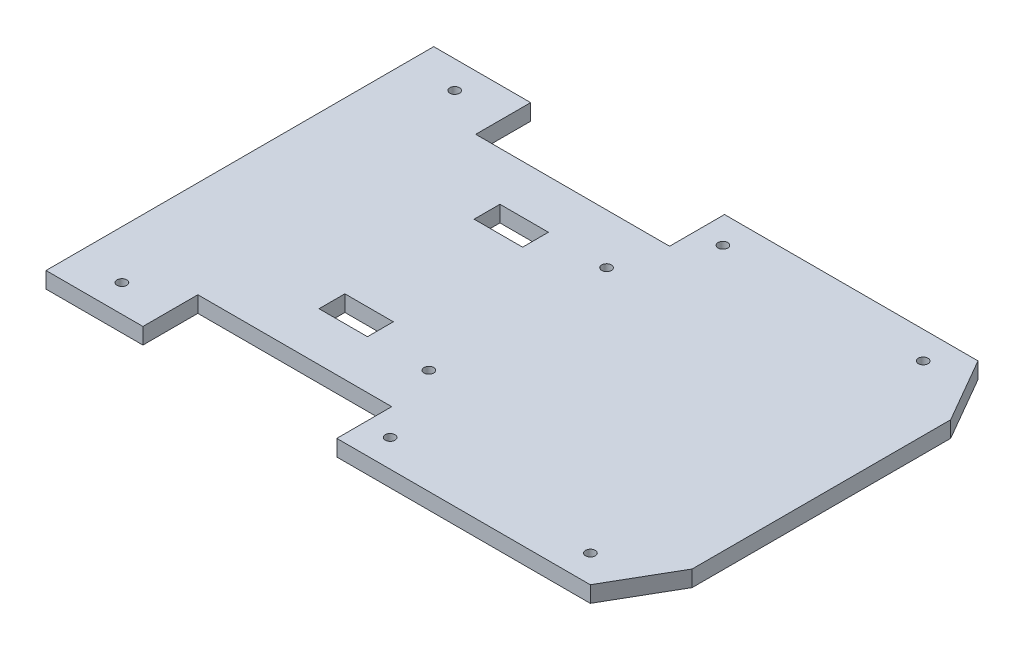
ISO-10303-21;
HEADER;
FILE_DESCRIPTION(('STEP AP214'),'2;1');
FILE_NAME('part.step','',(''),(''),'','','');
FILE_SCHEMA(('AUTOMOTIVE_DESIGN { 1 0 10303 214 1 1 1 1 }'));
ENDSEC;
DATA;
#1=APPLICATION_CONTEXT('core data for automotive mechanical design processes');
#2=APPLICATION_PROTOCOL_DEFINITION('international standard','automotive_design',2000,#1);
#3=PRODUCT_CONTEXT('',#1,'mechanical');
#4=PRODUCT('Part','Part','',(#3));
#5=PRODUCT_RELATED_PRODUCT_CATEGORY('part','',(#4));
#6=PRODUCT_DEFINITION_FORMATION('','',#4);
#7=PRODUCT_DEFINITION_CONTEXT('part definition',#1,'design');
#8=PRODUCT_DEFINITION('design','',#6,#7);
#9=PRODUCT_DEFINITION_SHAPE('','',#8);
#10=(LENGTH_UNIT() NAMED_UNIT(*) SI_UNIT(.MILLI.,.METRE.));
#11=(NAMED_UNIT(*) PLANE_ANGLE_UNIT() SI_UNIT($,.RADIAN.));
#12=(NAMED_UNIT(*) SI_UNIT($,.STERADIAN.) SOLID_ANGLE_UNIT());
#13=UNCERTAINTY_MEASURE_WITH_UNIT(LENGTH_MEASURE(1.E-05),#10,'distance_accuracy_value','');
#14=(GEOMETRIC_REPRESENTATION_CONTEXT(3) GLOBAL_UNCERTAINTY_ASSIGNED_CONTEXT((#13)) GLOBAL_UNIT_ASSIGNED_CONTEXT((#10,
#11,#12)) REPRESENTATION_CONTEXT('',''));
#15=CARTESIAN_POINT('',(0.,0.,0.));
#16=DIRECTION('',(0.,0.,1.));
#17=DIRECTION('',(1.,0.,0.));
#18=AXIS2_PLACEMENT_3D('',#15,#16,#17);
#19=CARTESIAN_POINT('',(0.,5.,0.));
#20=DIRECTION('',(0.,-1.,0.));
#21=DIRECTION('',(0.,0.,-1.));
#22=AXIS2_PLACEMENT_3D('',#19,#20,#21);
#23=PLANE('',#22);
#24=DIRECTION('',(0.,0.,1.));
#25=VECTOR('',#24,1.);
#26=CARTESIAN_POINT('',(-90.,5.,0.));
#27=LINE('',#26,#25);
#28=CARTESIAN_POINT('',(-90.,5.,-60.));
#29=VERTEX_POINT('',#28);
#30=CARTESIAN_POINT('',(-90.,5.,60.));
#31=VERTEX_POINT('',#30);
#32=EDGE_CURVE('E386',#29,#31,#27,.T.);
#33=ORIENTED_EDGE('',*,*,#32,.T.);
#34=DIRECTION('',(-1.,0.,0.));
#35=VECTOR('',#34,1.);
#36=CARTESIAN_POINT('',(-90.,5.,60.));
#37=LINE('',#36,#35);
#38=CARTESIAN_POINT('',(-60.,5.,60.));
#39=VERTEX_POINT('',#38);
#40=EDGE_CURVE('E246',#39,#31,#37,.T.);
#41=ORIENTED_EDGE('',*,*,#40,.F.);
#42=DIRECTION('',(0.,0.,1.));
#43=VECTOR('',#42,1.);
#44=CARTESIAN_POINT('',(-60.,5.,60.));
#45=LINE('',#44,#43);
#46=CARTESIAN_POINT('',(-60.,5.,43.));
#47=VERTEX_POINT('',#46);
#48=EDGE_CURVE('E250',#47,#39,#45,.T.);
#49=ORIENTED_EDGE('',*,*,#48,.F.);
#50=DIRECTION('',(-1.,0.,0.));
#51=VECTOR('',#50,1.);
#52=CARTESIAN_POINT('',(-60.,5.,43.));
#53=LINE('',#52,#51);
#54=CARTESIAN_POINT('',(0.,5.,43.));
#55=VERTEX_POINT('',#54);
#56=EDGE_CURVE('E255',#55,#47,#53,.T.);
#57=ORIENTED_EDGE('',*,*,#56,.F.);
#58=DIRECTION('',(0.,0.,-1.));
#59=VECTOR('',#58,1.);
#60=CARTESIAN_POINT('',(0.,5.,43.));
#61=LINE('',#60,#59);
#62=CARTESIAN_POINT('',(0.,5.,60.));
#63=VERTEX_POINT('',#62);
#64=EDGE_CURVE('E259',#63,#55,#61,.T.);
#65=ORIENTED_EDGE('',*,*,#64,.F.);
#66=DIRECTION('',(-1.,0.,0.));
#67=VECTOR('',#66,1.);
#68=CARTESIAN_POINT('',(0.,5.,60.));
#69=LINE('',#68,#67);
#70=CARTESIAN_POINT('',(78.4529946162075,5.,60.));
#71=VERTEX_POINT('',#70);
#72=EDGE_CURVE('E263',#71,#63,#69,.T.);
#73=ORIENTED_EDGE('',*,*,#72,.F.);
#74=DIRECTION('',(-0.499999999999998,0.,0.86602540378444));
#75=VECTOR('',#74,1.);
#76=CARTESIAN_POINT('',(78.4529946162075,5.,60.));
#77=LINE('',#76,#75);
#78=CARTESIAN_POINT('',(90.,5.,40.));
#79=VERTEX_POINT('',#78);
#80=EDGE_CURVE('E267',#79,#71,#77,.T.);
#81=ORIENTED_EDGE('',*,*,#80,.F.);
#82=DIRECTION('',(0.,0.,-1.));
#83=VECTOR('',#82,1.);
#84=CARTESIAN_POINT('',(90.,5.,0.));
#85=LINE('',#84,#83);
#86=CARTESIAN_POINT('',(90.,5.,-40.));
#87=VERTEX_POINT('',#86);
#88=EDGE_CURVE('E389',#79,#87,#85,.T.);
#89=ORIENTED_EDGE('',*,*,#88,.T.);
#90=DIRECTION('',(-0.499999999999998,0.,-0.86602540378444));
#91=VECTOR('',#90,1.);
#92=CARTESIAN_POINT('',(78.4529946162075,5.,-60.));
#93=LINE('',#92,#91);
#94=CARTESIAN_POINT('',(78.4529946162075,5.,-60.));
#95=VERTEX_POINT('',#94);
#96=EDGE_CURVE('E393',#87,#95,#93,.T.);
#97=ORIENTED_EDGE('',*,*,#96,.T.);
#98=DIRECTION('',(-1.,0.,0.));
#99=VECTOR('',#98,1.);
#100=CARTESIAN_POINT('',(0.,5.,-60.));
#101=LINE('',#100,#99);
#102=CARTESIAN_POINT('',(0.,5.,-60.));
#103=VERTEX_POINT('',#102);
#104=EDGE_CURVE('E396',#95,#103,#101,.T.);
#105=ORIENTED_EDGE('',*,*,#104,.T.);
#106=DIRECTION('',(0.,0.,1.));
#107=VECTOR('',#106,1.);
#108=CARTESIAN_POINT('',(0.,5.,-43.));
#109=LINE('',#108,#107);
#110=CARTESIAN_POINT('',(0.,5.,-43.));
#111=VERTEX_POINT('',#110);
#112=EDGE_CURVE('E399',#103,#111,#109,.T.);
#113=ORIENTED_EDGE('',*,*,#112,.T.);
#114=DIRECTION('',(-1.,0.,0.));
#115=VECTOR('',#114,1.);
#116=CARTESIAN_POINT('',(-60.,5.,-43.));
#117=LINE('',#116,#115);
#118=CARTESIAN_POINT('',(-60.,5.,-43.));
#119=VERTEX_POINT('',#118);
#120=EDGE_CURVE('E402',#111,#119,#117,.T.);
#121=ORIENTED_EDGE('',*,*,#120,.T.);
#122=DIRECTION('',(0.,0.,-1.));
#123=VECTOR('',#122,1.);
#124=CARTESIAN_POINT('',(-60.,5.,-60.));
#125=LINE('',#124,#123);
#126=CARTESIAN_POINT('',(-60.,5.,-60.));
#127=VERTEX_POINT('',#126);
#128=EDGE_CURVE('E405',#119,#127,#125,.T.);
#129=ORIENTED_EDGE('',*,*,#128,.T.);
#130=DIRECTION('',(-1.,0.,0.));
#131=VECTOR('',#130,1.);
#132=CARTESIAN_POINT('',(-90.,5.,-60.));
#133=LINE('',#132,#131);
#134=EDGE_CURVE('E408',#127,#29,#133,.T.);
#135=ORIENTED_EDGE('',*,*,#134,.T.);
#136=EDGE_LOOP('',(#33,#41,#49,#57,#65,#73,#81,#89,#97,#105,#113,#121,#129,#135));
#137=FACE_BOUND('',#136,.T.);
#138=DIRECTION('',(0.,0.,1.));
#139=VECTOR('',#138,1.);
#140=CARTESIAN_POINT('',(-37.5,5.,-28.));
#141=LINE('',#140,#139);
#142=CARTESIAN_POINT('',(-37.5,5.,-28.));
#143=VERTEX_POINT('',#142);
#144=CARTESIAN_POINT('',(-37.5,5.,-20.));
#145=VERTEX_POINT('',#144);
#146=EDGE_CURVE('E348',#143,#145,#141,.T.);
#147=ORIENTED_EDGE('',*,*,#146,.F.);
#148=DIRECTION('',(-1.,0.,0.));
#149=VECTOR('',#148,1.);
#150=CARTESIAN_POINT('',(-37.5,5.,-28.));
#151=LINE('',#150,#149);
#152=CARTESIAN_POINT('',(-22.5,5.,-28.));
#153=VERTEX_POINT('',#152);
#154=EDGE_CURVE('E358',#153,#143,#151,.T.);
#155=ORIENTED_EDGE('',*,*,#154,.F.);
#156=DIRECTION('',(0.,0.,-1.));
#157=VECTOR('',#156,1.);
#158=CARTESIAN_POINT('',(-22.5,5.,-28.));
#159=LINE('',#158,#157);
#160=CARTESIAN_POINT('',(-22.5,5.,-20.));
#161=VERTEX_POINT('',#160);
#162=EDGE_CURVE('E355',#161,#153,#159,.T.);
#163=ORIENTED_EDGE('',*,*,#162,.F.);
#164=DIRECTION('',(1.,0.,0.));
#165=VECTOR('',#164,1.);
#166=CARTESIAN_POINT('',(-37.5,5.,-20.));
#167=LINE('',#166,#165);
#168=EDGE_CURVE('E351',#145,#161,#167,.T.);
#169=ORIENTED_EDGE('',*,*,#168,.F.);
#170=EDGE_LOOP('',(#147,#155,#163,#169));
#171=FACE_BOUND('',#170,.T.);
#172=CARTESIAN_POINT('',(-75.,5.,-51.5));
#173=DIRECTION('',(0.,1.,0.));
#174=DIRECTION('',(0.,0.,1.));
#175=AXIS2_PLACEMENT_3D('',#172,#173,#174);
#176=CIRCLE('',#175,1.5);
#177=CARTESIAN_POINT('',(-75.,5.,-50.));
#178=VERTEX_POINT('',#177);
#179=EDGE_CURVE('E341',#178,#178,#176,.T.);
#180=ORIENTED_EDGE('',*,*,#179,.F.);
#181=EDGE_LOOP('',(#180));
#182=FACE_BOUND('',#181,.T.);
#183=CARTESIAN_POINT('',(7.99999999999998,5.,-51.5));
#184=DIRECTION('',(0.,1.,0.));
#185=DIRECTION('',(0.,0.,1.));
#186=AXIS2_PLACEMENT_3D('',#183,#184,#185);
#187=CIRCLE('',#186,1.5);
#188=CARTESIAN_POINT('',(7.99999999999998,5.,-50.));
#189=VERTEX_POINT('',#188);
#190=EDGE_CURVE('E333',#189,#189,#187,.T.);
#191=ORIENTED_EDGE('',*,*,#190,.F.);
#192=EDGE_LOOP('',(#191));
#193=FACE_BOUND('',#192,.T.);
#194=CARTESIAN_POINT('',(70.,5.,-51.5));
#195=DIRECTION('',(0.,1.,0.));
#196=DIRECTION('',(0.,0.,1.));
#197=AXIS2_PLACEMENT_3D('',#194,#195,#196);
#198=CIRCLE('',#197,1.5);
#199=CARTESIAN_POINT('',(70.,5.,-50.));
#200=VERTEX_POINT('',#199);
#201=EDGE_CURVE('E325',#200,#200,#198,.T.);
#202=ORIENTED_EDGE('',*,*,#201,.F.);
#203=EDGE_LOOP('',(#202));
#204=FACE_BOUND('',#203,.T.);
#205=CARTESIAN_POINT('',(-4.00000000000002,5.,-27.5));
#206=DIRECTION('',(0.,1.,0.));
#207=DIRECTION('',(0.,0.,1.));
#208=AXIS2_PLACEMENT_3D('',#205,#206,#207);
#209=CIRCLE('',#208,1.5);
#210=CARTESIAN_POINT('',(-4.00000000000002,5.,-26.));
#211=VERTEX_POINT('',#210);
#212=EDGE_CURVE('E317',#211,#211,#209,.T.);
#213=ORIENTED_EDGE('',*,*,#212,.F.);
#214=EDGE_LOOP('',(#213));
#215=FACE_BOUND('',#214,.T.);
#216=CARTESIAN_POINT('',(-4.00000000000002,5.,27.5));
#217=DIRECTION('',(0.,-1.,0.));
#218=DIRECTION('',(0.,0.,-1.));
#219=AXIS2_PLACEMENT_3D('',#216,#217,#218);
#220=CIRCLE('',#219,1.5);
#221=CARTESIAN_POINT('',(-4.00000000000002,5.,26.));
#222=VERTEX_POINT('',#221);
#223=EDGE_CURVE('E611',#222,#222,#220,.T.);
#224=ORIENTED_EDGE('',*,*,#223,.T.);
#225=EDGE_LOOP('',(#224));
#226=FACE_BOUND('',#225,.T.);
#227=CARTESIAN_POINT('',(70.,5.,51.5));
#228=DIRECTION('',(0.,-1.,0.));
#229=DIRECTION('',(0.,0.,-1.));
#230=AXIS2_PLACEMENT_3D('',#227,#228,#229);
#231=CIRCLE('',#230,1.5);
#232=CARTESIAN_POINT('',(70.,5.,50.));
#233=VERTEX_POINT('',#232);
#234=EDGE_CURVE('E622',#233,#233,#231,.T.);
#235=ORIENTED_EDGE('',*,*,#234,.T.);
#236=EDGE_LOOP('',(#235));
#237=FACE_BOUND('',#236,.T.);
#238=CARTESIAN_POINT('',(7.99999999999998,5.,51.5));
#239=DIRECTION('',(0.,-1.,0.));
#240=DIRECTION('',(0.,0.,-1.));
#241=AXIS2_PLACEMENT_3D('',#238,#239,#240);
#242=CIRCLE('',#241,1.5);
#243=CARTESIAN_POINT('',(7.99999999999998,5.,50.));
#244=VERTEX_POINT('',#243);
#245=EDGE_CURVE('E630',#244,#244,#242,.T.);
#246=ORIENTED_EDGE('',*,*,#245,.T.);
#247=EDGE_LOOP('',(#246));
#248=FACE_BOUND('',#247,.T.);
#249=CARTESIAN_POINT('',(-75.,5.,51.5));
#250=DIRECTION('',(0.,-1.,0.));
#251=DIRECTION('',(0.,0.,-1.));
#252=AXIS2_PLACEMENT_3D('',#249,#250,#251);
#253=CIRCLE('',#252,1.5);
#254=CARTESIAN_POINT('',(-75.,5.,50.));
#255=VERTEX_POINT('',#254);
#256=EDGE_CURVE('E229',#255,#255,#253,.T.);
#257=ORIENTED_EDGE('',*,*,#256,.T.);
#258=EDGE_LOOP('',(#257));
#259=FACE_BOUND('',#258,.T.);
#260=DIRECTION('',(-1.,0.,0.));
#261=VECTOR('',#260,1.);
#262=CARTESIAN_POINT('',(-37.5,5.,28.));
#263=LINE('',#262,#261);
#264=CARTESIAN_POINT('',(-22.5,5.,28.));
#265=VERTEX_POINT('',#264);
#266=CARTESIAN_POINT('',(-37.5,5.,28.));
#267=VERTEX_POINT('',#266);
#268=EDGE_CURVE('E195',#265,#267,#263,.T.);
#269=ORIENTED_EDGE('',*,*,#268,.T.);
#270=DIRECTION('',(0.,0.,-1.));
#271=VECTOR('',#270,1.);
#272=CARTESIAN_POINT('',(-37.5,5.,28.));
#273=LINE('',#272,#271);
#274=CARTESIAN_POINT('',(-37.5,5.,20.));
#275=VERTEX_POINT('',#274);
#276=EDGE_CURVE('E206',#267,#275,#273,.T.);
#277=ORIENTED_EDGE('',*,*,#276,.T.);
#278=DIRECTION('',(1.,0.,0.));
#279=VECTOR('',#278,1.);
#280=CARTESIAN_POINT('',(-37.5,5.,20.));
#281=LINE('',#280,#279);
#282=CARTESIAN_POINT('',(-22.5,5.,20.));
#283=VERTEX_POINT('',#282);
#284=EDGE_CURVE('E220',#275,#283,#281,.T.);
#285=ORIENTED_EDGE('',*,*,#284,.T.);
#286=DIRECTION('',(0.,0.,1.));
#287=VECTOR('',#286,1.);
#288=CARTESIAN_POINT('',(-22.5,5.,28.));
#289=LINE('',#288,#287);
#290=EDGE_CURVE('E216',#283,#265,#289,.T.);
#291=ORIENTED_EDGE('',*,*,#290,.T.);
#292=EDGE_LOOP('',(#269,#277,#285,#291));
#293=FACE_BOUND('',#292,.T.);
#294=ADVANCED_FACE('F39',(#137,#171,#182,#193,#204,#215,#226,#237,#248,#259,#293),#23,.F.);
#295=CARTESIAN_POINT('',(0.,0.,0.));
#296=DIRECTION('',(0.,-1.,0.));
#297=DIRECTION('',(0.,0.,-1.));
#298=AXIS2_PLACEMENT_3D('',#295,#296,#297);
#299=PLANE('',#298);
#300=CARTESIAN_POINT('',(70.,0.,-51.5));
#301=DIRECTION('',(0.,1.,0.));
#302=DIRECTION('',(0.,0.,1.));
#303=AXIS2_PLACEMENT_3D('',#300,#301,#302);
#304=CIRCLE('',#303,1.5);
#305=CARTESIAN_POINT('',(70.,0.,-50.));
#306=VERTEX_POINT('',#305);
#307=EDGE_CURVE('E321',#306,#306,#304,.T.);
#308=ORIENTED_EDGE('',*,*,#307,.T.);
#309=EDGE_LOOP('',(#308));
#310=FACE_BOUND('',#309,.T.);
#311=CARTESIAN_POINT('',(-75.,0.,-51.5));
#312=DIRECTION('',(0.,1.,0.));
#313=DIRECTION('',(0.,0.,1.));
#314=AXIS2_PLACEMENT_3D('',#311,#312,#313);
#315=CIRCLE('',#314,1.5);
#316=CARTESIAN_POINT('',(-75.,0.,-50.));
#317=VERTEX_POINT('',#316);
#318=EDGE_CURVE('E337',#317,#317,#315,.T.);
#319=ORIENTED_EDGE('',*,*,#318,.T.);
#320=EDGE_LOOP('',(#319));
#321=FACE_BOUND('',#320,.T.);
#322=DIRECTION('',(0.,0.,1.));
#323=VECTOR('',#322,1.);
#324=CARTESIAN_POINT('',(-90.,0.,0.));
#325=LINE('',#324,#323);
#326=CARTESIAN_POINT('',(-90.,0.,-60.));
#327=VERTEX_POINT('',#326);
#328=CARTESIAN_POINT('',(-90.,0.,60.));
#329=VERTEX_POINT('',#328);
#330=EDGE_CURVE('E385',#327,#329,#325,.T.);
#331=ORIENTED_EDGE('',*,*,#330,.F.);
#332=DIRECTION('',(-1.,0.,0.));
#333=VECTOR('',#332,1.);
#334=CARTESIAN_POINT('',(-90.,0.,-60.));
#335=LINE('',#334,#333);
#336=CARTESIAN_POINT('',(-60.,0.,-60.));
#337=VERTEX_POINT('',#336);
#338=EDGE_CURVE('E390',#337,#327,#335,.T.);
#339=ORIENTED_EDGE('',*,*,#338,.F.);
#340=DIRECTION('',(0.,0.,-1.));
#341=VECTOR('',#340,1.);
#342=CARTESIAN_POINT('',(-60.,0.,-60.));
#343=LINE('',#342,#341);
#344=CARTESIAN_POINT('',(-60.,0.,-43.));
#345=VERTEX_POINT('',#344);
#346=EDGE_CURVE('E429',#345,#337,#343,.T.);
#347=ORIENTED_EDGE('',*,*,#346,.F.);
#348=DIRECTION('',(-1.,0.,0.));
#349=VECTOR('',#348,1.);
#350=CARTESIAN_POINT('',(-60.,0.,-43.));
#351=LINE('',#350,#349);
#352=CARTESIAN_POINT('',(0.,0.,-43.));
#353=VERTEX_POINT('',#352);
#354=EDGE_CURVE('E426',#353,#345,#351,.T.);
#355=ORIENTED_EDGE('',*,*,#354,.F.);
#356=DIRECTION('',(0.,0.,1.));
#357=VECTOR('',#356,1.);
#358=CARTESIAN_POINT('',(0.,0.,-43.));
#359=LINE('',#358,#357);
#360=CARTESIAN_POINT('',(0.,0.,-60.));
#361=VERTEX_POINT('',#360);
#362=EDGE_CURVE('E423',#361,#353,#359,.T.);
#363=ORIENTED_EDGE('',*,*,#362,.F.);
#364=DIRECTION('',(-1.,0.,0.));
#365=VECTOR('',#364,1.);
#366=CARTESIAN_POINT('',(0.,0.,-60.));
#367=LINE('',#366,#365);
#368=CARTESIAN_POINT('',(78.4529946162075,0.,-60.));
#369=VERTEX_POINT('',#368);
#370=EDGE_CURVE('E420',#369,#361,#367,.T.);
#371=ORIENTED_EDGE('',*,*,#370,.F.);
#372=DIRECTION('',(-0.499999999999998,0.,-0.86602540378444));
#373=VECTOR('',#372,1.);
#374=CARTESIAN_POINT('',(78.4529946162075,0.,-60.));
#375=LINE('',#374,#373);
#376=CARTESIAN_POINT('',(90.,0.,-40.));
#377=VERTEX_POINT('',#376);
#378=EDGE_CURVE('E417',#377,#369,#375,.T.);
#379=ORIENTED_EDGE('',*,*,#378,.F.);
#380=DIRECTION('',(0.,0.,-1.));
#381=VECTOR('',#380,1.);
#382=CARTESIAN_POINT('',(90.,0.,0.));
#383=LINE('',#382,#381);
#384=CARTESIAN_POINT('',(90.,0.,40.));
#385=VERTEX_POINT('',#384);
#386=EDGE_CURVE('E414',#385,#377,#383,.T.);
#387=ORIENTED_EDGE('',*,*,#386,.F.);
#388=DIRECTION('',(-0.499999999999998,0.,0.86602540378444));
#389=VECTOR('',#388,1.);
#390=CARTESIAN_POINT('',(78.4529946162075,0.,60.));
#391=LINE('',#390,#389);
#392=CARTESIAN_POINT('',(78.4529946162075,0.,60.));
#393=VERTEX_POINT('',#392);
#394=EDGE_CURVE('E251',#385,#393,#391,.T.);
#395=ORIENTED_EDGE('',*,*,#394,.T.);
#396=DIRECTION('',(-1.,0.,0.));
#397=VECTOR('',#396,1.);
#398=CARTESIAN_POINT('',(0.,0.,60.));
#399=LINE('',#398,#397);
#400=CARTESIAN_POINT('',(0.,0.,60.));
#401=VERTEX_POINT('',#400);
#402=EDGE_CURVE('E287',#393,#401,#399,.T.);
#403=ORIENTED_EDGE('',*,*,#402,.T.);
#404=DIRECTION('',(0.,0.,-1.));
#405=VECTOR('',#404,1.);
#406=CARTESIAN_POINT('',(0.,0.,43.));
#407=LINE('',#406,#405);
#408=CARTESIAN_POINT('',(0.,0.,43.));
#409=VERTEX_POINT('',#408);
#410=EDGE_CURVE('E283',#401,#409,#407,.T.);
#411=ORIENTED_EDGE('',*,*,#410,.T.);
#412=DIRECTION('',(-1.,0.,0.));
#413=VECTOR('',#412,1.);
#414=CARTESIAN_POINT('',(-60.,0.,43.));
#415=LINE('',#414,#413);
#416=CARTESIAN_POINT('',(-60.,0.,43.));
#417=VERTEX_POINT('',#416);
#418=EDGE_CURVE('E279',#409,#417,#415,.T.);
#419=ORIENTED_EDGE('',*,*,#418,.T.);
#420=DIRECTION('',(0.,0.,1.));
#421=VECTOR('',#420,1.);
#422=CARTESIAN_POINT('',(-60.,0.,60.));
#423=LINE('',#422,#421);
#424=CARTESIAN_POINT('',(-60.,0.,60.));
#425=VERTEX_POINT('',#424);
#426=EDGE_CURVE('E275',#417,#425,#423,.T.);
#427=ORIENTED_EDGE('',*,*,#426,.T.);
#428=DIRECTION('',(-1.,0.,0.));
#429=VECTOR('',#428,1.);
#430=CARTESIAN_POINT('',(-90.,0.,60.));
#431=LINE('',#430,#429);
#432=EDGE_CURVE('E202',#425,#329,#431,.T.);
#433=ORIENTED_EDGE('',*,*,#432,.T.);
#434=EDGE_LOOP('',(#331,#339,#347,#355,#363,#371,#379,#387,#395,#403,#411,#419,#427,#433));
#435=FACE_BOUND('',#434,.T.);
#436=DIRECTION('',(-1.,0.,0.));
#437=VECTOR('',#436,1.);
#438=CARTESIAN_POINT('',(-37.5,0.,-28.));
#439=LINE('',#438,#437);
#440=CARTESIAN_POINT('',(-22.5,0.,-28.));
#441=VERTEX_POINT('',#440);
#442=CARTESIAN_POINT('',(-37.5,0.,-28.));
#443=VERTEX_POINT('',#442);
#444=EDGE_CURVE('E352',#441,#443,#439,.T.);
#445=ORIENTED_EDGE('',*,*,#444,.T.);
#446=DIRECTION('',(0.,0.,1.));
#447=VECTOR('',#446,1.);
#448=CARTESIAN_POINT('',(-37.5,0.,-28.));
#449=LINE('',#448,#447);
#450=CARTESIAN_POINT('',(-37.5,0.,-20.));
#451=VERTEX_POINT('',#450);
#452=EDGE_CURVE('E63',#443,#451,#449,.T.);
#453=ORIENTED_EDGE('',*,*,#452,.T.);
#454=DIRECTION('',(1.,0.,0.));
#455=VECTOR('',#454,1.);
#456=CARTESIAN_POINT('',(-37.5,0.,-20.));
#457=LINE('',#456,#455);
#458=CARTESIAN_POINT('',(-22.5,0.,-20.));
#459=VERTEX_POINT('',#458);
#460=EDGE_CURVE('E364',#451,#459,#457,.T.);
#461=ORIENTED_EDGE('',*,*,#460,.T.);
#462=DIRECTION('',(0.,0.,-1.));
#463=VECTOR('',#462,1.);
#464=CARTESIAN_POINT('',(-22.5,0.,-28.));
#465=LINE('',#464,#463);
#466=EDGE_CURVE('E368',#459,#441,#465,.T.);
#467=ORIENTED_EDGE('',*,*,#466,.T.);
#468=EDGE_LOOP('',(#445,#453,#461,#467));
#469=FACE_BOUND('',#468,.T.);
#470=CARTESIAN_POINT('',(7.99999999999998,0.,-51.5));
#471=DIRECTION('',(0.,1.,0.));
#472=DIRECTION('',(0.,0.,1.));
#473=AXIS2_PLACEMENT_3D('',#470,#471,#472);
#474=CIRCLE('',#473,1.5);
#475=CARTESIAN_POINT('',(7.99999999999998,0.,-50.));
#476=VERTEX_POINT('',#475);
#477=EDGE_CURVE('E329',#476,#476,#474,.T.);
#478=ORIENTED_EDGE('',*,*,#477,.T.);
#479=EDGE_LOOP('',(#478));
#480=FACE_BOUND('',#479,.T.);
#481=CARTESIAN_POINT('',(-4.00000000000002,0.,-27.5));
#482=DIRECTION('',(0.,1.,0.));
#483=DIRECTION('',(0.,0.,1.));
#484=AXIS2_PLACEMENT_3D('',#481,#482,#483);
#485=CIRCLE('',#484,1.5);
#486=CARTESIAN_POINT('',(-4.00000000000002,0.,-26.));
#487=VERTEX_POINT('',#486);
#488=EDGE_CURVE('E316',#487,#487,#485,.T.);
#489=ORIENTED_EDGE('',*,*,#488,.T.);
#490=EDGE_LOOP('',(#489));
#491=FACE_BOUND('',#490,.T.);
#492=CARTESIAN_POINT('',(-4.00000000000002,0.,27.5));
#493=DIRECTION('',(0.,-1.,0.));
#494=DIRECTION('',(0.,0.,-1.));
#495=AXIS2_PLACEMENT_3D('',#492,#493,#494);
#496=CIRCLE('',#495,1.5);
#497=CARTESIAN_POINT('',(-4.00000000000002,0.,26.));
#498=VERTEX_POINT('',#497);
#499=EDGE_CURVE('E614',#498,#498,#496,.T.);
#500=ORIENTED_EDGE('',*,*,#499,.F.);
#501=EDGE_LOOP('',(#500));
#502=FACE_BOUND('',#501,.T.);
#503=CARTESIAN_POINT('',(70.,0.,51.5));
#504=DIRECTION('',(0.,-1.,0.));
#505=DIRECTION('',(0.,0.,-1.));
#506=AXIS2_PLACEMENT_3D('',#503,#504,#505);
#507=CIRCLE('',#506,1.5);
#508=CARTESIAN_POINT('',(70.,0.,50.));
#509=VERTEX_POINT('',#508);
#510=EDGE_CURVE('E619',#509,#509,#507,.T.);
#511=ORIENTED_EDGE('',*,*,#510,.F.);
#512=EDGE_LOOP('',(#511));
#513=FACE_BOUND('',#512,.T.);
#514=CARTESIAN_POINT('',(7.99999999999998,0.,51.5));
#515=DIRECTION('',(0.,-1.,0.));
#516=DIRECTION('',(0.,0.,-1.));
#517=AXIS2_PLACEMENT_3D('',#514,#515,#516);
#518=CIRCLE('',#517,1.5);
#519=CARTESIAN_POINT('',(7.99999999999998,0.,50.));
#520=VERTEX_POINT('',#519);
#521=EDGE_CURVE('E626',#520,#520,#518,.T.);
#522=ORIENTED_EDGE('',*,*,#521,.F.);
#523=EDGE_LOOP('',(#522));
#524=FACE_BOUND('',#523,.T.);
#525=CARTESIAN_POINT('',(-75.,0.,51.5));
#526=DIRECTION('',(0.,-1.,0.));
#527=DIRECTION('',(0.,0.,-1.));
#528=AXIS2_PLACEMENT_3D('',#525,#526,#527);
#529=CIRCLE('',#528,1.5);
#530=CARTESIAN_POINT('',(-75.,0.,50.));
#531=VERTEX_POINT('',#530);
#532=EDGE_CURVE('E634',#531,#531,#529,.T.);
#533=ORIENTED_EDGE('',*,*,#532,.F.);
#534=EDGE_LOOP('',(#533));
#535=FACE_BOUND('',#534,.T.);
#536=DIRECTION('',(0.,0.,-1.));
#537=VECTOR('',#536,1.);
#538=CARTESIAN_POINT('',(-37.5,0.,28.));
#539=LINE('',#538,#537);
#540=CARTESIAN_POINT('',(-37.5,0.,28.));
#541=VERTEX_POINT('',#540);
#542=CARTESIAN_POINT('',(-37.5,0.,20.));
#543=VERTEX_POINT('',#542);
#544=EDGE_CURVE('E226',#541,#543,#539,.T.);
#545=ORIENTED_EDGE('',*,*,#544,.F.);
#546=DIRECTION('',(-1.,0.,0.));
#547=VECTOR('',#546,1.);
#548=CARTESIAN_POINT('',(-37.5,0.,28.));
#549=LINE('',#548,#547);
#550=CARTESIAN_POINT('',(-22.5,0.,28.));
#551=VERTEX_POINT('',#550);
#552=EDGE_CURVE('E198',#551,#541,#549,.T.);
#553=ORIENTED_EDGE('',*,*,#552,.F.);
#554=DIRECTION('',(0.,0.,1.));
#555=VECTOR('',#554,1.);
#556=CARTESIAN_POINT('',(-22.5,0.,28.));
#557=LINE('',#556,#555);
#558=CARTESIAN_POINT('',(-22.5,0.,20.));
#559=VERTEX_POINT('',#558);
#560=EDGE_CURVE('E232',#559,#551,#557,.T.);
#561=ORIENTED_EDGE('',*,*,#560,.F.);
#562=DIRECTION('',(1.,0.,0.));
#563=VECTOR('',#562,1.);
#564=CARTESIAN_POINT('',(-37.5,0.,20.));
#565=LINE('',#564,#563);
#566=EDGE_CURVE('E214',#543,#559,#565,.T.);
#567=ORIENTED_EDGE('',*,*,#566,.F.);
#568=EDGE_LOOP('',(#545,#553,#561,#567));
#569=FACE_BOUND('',#568,.T.);
#570=ADVANCED_FACE('F466',(#310,#321,#435,#469,#480,#491,#502,#513,#524,#535,#569),#299,.T.);
#571=CARTESIAN_POINT('',(-90.,5.,0.));
#572=DIRECTION('',(1.,0.,0.));
#573=DIRECTION('',(0.,0.,-1.));
#574=AXIS2_PLACEMENT_3D('',#571,#572,#573);
#575=PLANE('',#574);
#576=ORIENTED_EDGE('',*,*,#330,.T.);
#577=DIRECTION('',(0.,-1.,0.));
#578=VECTOR('',#577,1.);
#579=CARTESIAN_POINT('',(-90.,5.,60.));
#580=LINE('',#579,#578);
#581=EDGE_CURVE('E312',#31,#329,#580,.T.);
#582=ORIENTED_EDGE('',*,*,#581,.F.);
#583=ORIENTED_EDGE('',*,*,#32,.F.);
#584=DIRECTION('',(0.,-1.,0.));
#585=VECTOR('',#584,1.);
#586=CARTESIAN_POINT('',(-90.,5.,-60.));
#587=LINE('',#586,#585);
#588=EDGE_CURVE('E411',#29,#327,#587,.T.);
#589=ORIENTED_EDGE('',*,*,#588,.T.);
#590=EDGE_LOOP('',(#576,#582,#583,#589));
#591=FACE_BOUND('',#590,.T.);
#592=ADVANCED_FACE('F41',(#591),#575,.F.);
#593=CARTESIAN_POINT('',(90.,5.,0.));
#594=DIRECTION('',(-1.,0.,0.));
#595=DIRECTION('',(0.,0.,1.));
#596=AXIS2_PLACEMENT_3D('',#593,#594,#595);
#597=PLANE('',#596);
#598=ORIENTED_EDGE('',*,*,#386,.T.);
#599=DIRECTION('',(0.,-1.,0.));
#600=VECTOR('',#599,1.);
#601=CARTESIAN_POINT('',(90.,5.,-40.));
#602=LINE('',#601,#600);
#603=EDGE_CURVE('E11',#87,#377,#602,.T.);
#604=ORIENTED_EDGE('',*,*,#603,.F.);
#605=ORIENTED_EDGE('',*,*,#88,.F.);
#606=DIRECTION('',(0.,-1.,0.));
#607=VECTOR('',#606,1.);
#608=CARTESIAN_POINT('',(90.,5.,40.));
#609=LINE('',#608,#607);
#610=EDGE_CURVE('E271',#79,#385,#609,.T.);
#611=ORIENTED_EDGE('',*,*,#610,.T.);
#612=EDGE_LOOP('',(#598,#604,#605,#611));
#613=FACE_BOUND('',#612,.T.);
#614=ADVANCED_FACE('F486',(#613),#597,.F.);
#615=CARTESIAN_POINT('',(78.4529946162075,5.,-60.));
#616=DIRECTION('',(-0.86602540378444,0.,0.499999999999998));
#617=DIRECTION('',(0.499999999999998,0.,0.86602540378444));
#618=AXIS2_PLACEMENT_3D('',#615,#616,#617);
#619=PLANE('',#618);
#620=ORIENTED_EDGE('',*,*,#378,.T.);
#621=DIRECTION('',(0.,-1.,0.));
#622=VECTOR('',#621,1.);
#623=CARTESIAN_POINT('',(78.4529946162075,5.,-60.));
#624=LINE('',#623,#622);
#625=EDGE_CURVE('E48',#95,#369,#624,.T.);
#626=ORIENTED_EDGE('',*,*,#625,.F.);
#627=ORIENTED_EDGE('',*,*,#96,.F.);
#628=ORIENTED_EDGE('',*,*,#603,.T.);
#629=EDGE_LOOP('',(#620,#626,#627,#628));
#630=FACE_BOUND('',#629,.T.);
#631=ADVANCED_FACE('F484',(#630),#619,.F.);
#632=CARTESIAN_POINT('',(0.,5.,-60.));
#633=DIRECTION('',(0.,0.,1.));
#634=DIRECTION('',(1.,0.,0.));
#635=AXIS2_PLACEMENT_3D('',#632,#633,#634);
#636=PLANE('',#635);
#637=ORIENTED_EDGE('',*,*,#370,.T.);
#638=DIRECTION('',(0.,-1.,0.));
#639=VECTOR('',#638,1.);
#640=CARTESIAN_POINT('',(0.,5.,-60.));
#641=LINE('',#640,#639);
#642=EDGE_CURVE('E449',#103,#361,#641,.T.);
#643=ORIENTED_EDGE('',*,*,#642,.F.);
#644=ORIENTED_EDGE('',*,*,#104,.F.);
#645=ORIENTED_EDGE('',*,*,#625,.T.);
#646=EDGE_LOOP('',(#637,#643,#644,#645));
#647=FACE_BOUND('',#646,.T.);
#648=ADVANCED_FACE('F458',(#647),#636,.F.);
#649=CARTESIAN_POINT('',(0.,5.,-43.));
#650=DIRECTION('',(1.,0.,0.));
#651=DIRECTION('',(0.,0.,-1.));
#652=AXIS2_PLACEMENT_3D('',#649,#650,#651);
#653=PLANE('',#652);
#654=ORIENTED_EDGE('',*,*,#362,.T.);
#655=DIRECTION('',(0.,-1.,0.));
#656=VECTOR('',#655,1.);
#657=CARTESIAN_POINT('',(0.,5.,-43.));
#658=LINE('',#657,#656);
#659=EDGE_CURVE('E445',#111,#353,#658,.T.);
#660=ORIENTED_EDGE('',*,*,#659,.F.);
#661=ORIENTED_EDGE('',*,*,#112,.F.);
#662=ORIENTED_EDGE('',*,*,#642,.T.);
#663=EDGE_LOOP('',(#654,#660,#661,#662));
#664=FACE_BOUND('',#663,.T.);
#665=ADVANCED_FACE('F472',(#664),#653,.F.);
#666=CARTESIAN_POINT('',(-60.,5.,-43.));
#667=DIRECTION('',(0.,0.,1.));
#668=DIRECTION('',(1.,0.,0.));
#669=AXIS2_PLACEMENT_3D('',#666,#667,#668);
#670=PLANE('',#669);
#671=ORIENTED_EDGE('',*,*,#354,.T.);
#672=DIRECTION('',(0.,-1.,0.));
#673=VECTOR('',#672,1.);
#674=CARTESIAN_POINT('',(-60.,5.,-43.));
#675=LINE('',#674,#673);
#676=EDGE_CURVE('E441',#119,#345,#675,.T.);
#677=ORIENTED_EDGE('',*,*,#676,.F.);
#678=ORIENTED_EDGE('',*,*,#120,.F.);
#679=ORIENTED_EDGE('',*,*,#659,.T.);
#680=EDGE_LOOP('',(#671,#677,#678,#679));
#681=FACE_BOUND('',#680,.T.);
#682=ADVANCED_FACE('F476',(#681),#670,.F.);
#683=CARTESIAN_POINT('',(-60.,5.,-60.));
#684=DIRECTION('',(-1.,0.,0.));
#685=DIRECTION('',(0.,0.,1.));
#686=AXIS2_PLACEMENT_3D('',#683,#684,#685);
#687=PLANE('',#686);
#688=ORIENTED_EDGE('',*,*,#346,.T.);
#689=DIRECTION('',(0.,-1.,0.));
#690=VECTOR('',#689,1.);
#691=CARTESIAN_POINT('',(-60.,5.,-60.));
#692=LINE('',#691,#690);
#693=EDGE_CURVE('E437',#127,#337,#692,.T.);
#694=ORIENTED_EDGE('',*,*,#693,.F.);
#695=ORIENTED_EDGE('',*,*,#128,.F.);
#696=ORIENTED_EDGE('',*,*,#676,.T.);
#697=EDGE_LOOP('',(#688,#694,#695,#696));
#698=FACE_BOUND('',#697,.T.);
#699=ADVANCED_FACE('F520',(#698),#687,.F.);
#700=CARTESIAN_POINT('',(-90.,5.,-60.));
#701=DIRECTION('',(0.,0.,1.));
#702=DIRECTION('',(1.,0.,0.));
#703=AXIS2_PLACEMENT_3D('',#700,#701,#702);
#704=PLANE('',#703);
#705=ORIENTED_EDGE('',*,*,#338,.T.);
#706=ORIENTED_EDGE('',*,*,#588,.F.);
#707=ORIENTED_EDGE('',*,*,#134,.F.);
#708=ORIENTED_EDGE('',*,*,#693,.T.);
#709=EDGE_LOOP('',(#705,#706,#707,#708));
#710=FACE_BOUND('',#709,.T.);
#711=ADVANCED_FACE('F518',(#710),#704,.F.);
#712=CARTESIAN_POINT('',(-37.5,5.,-28.));
#713=DIRECTION('',(1.,0.,0.));
#714=DIRECTION('',(0.,0.,-1.));
#715=AXIS2_PLACEMENT_3D('',#712,#713,#714);
#716=PLANE('',#715);
#717=ORIENTED_EDGE('',*,*,#452,.F.);
#718=DIRECTION('',(0.,-1.,0.));
#719=VECTOR('',#718,1.);
#720=CARTESIAN_POINT('',(-37.5,5.,-28.));
#721=LINE('',#720,#719);
#722=EDGE_CURVE('E361',#143,#443,#721,.T.);
#723=ORIENTED_EDGE('',*,*,#722,.F.);
#724=ORIENTED_EDGE('',*,*,#146,.T.);
#725=DIRECTION('',(0.,-1.,0.));
#726=VECTOR('',#725,1.);
#727=CARTESIAN_POINT('',(-37.5,5.,-20.));
#728=LINE('',#727,#726);
#729=EDGE_CURVE('E382',#145,#451,#728,.T.);
#730=ORIENTED_EDGE('',*,*,#729,.T.);
#731=EDGE_LOOP('',(#717,#723,#724,#730));
#732=FACE_BOUND('',#731,.T.);
#733=ADVANCED_FACE('F527',(#732),#716,.T.);
#734=CARTESIAN_POINT('',(-37.5,5.,-20.));
#735=DIRECTION('',(0.,0.,-1.));
#736=DIRECTION('',(-1.,0.,0.));
#737=AXIS2_PLACEMENT_3D('',#734,#735,#736);
#738=PLANE('',#737);
#739=ORIENTED_EDGE('',*,*,#460,.F.);
#740=ORIENTED_EDGE('',*,*,#729,.F.);
#741=ORIENTED_EDGE('',*,*,#168,.T.);
#742=DIRECTION('',(0.,-1.,0.));
#743=VECTOR('',#742,1.);
#744=CARTESIAN_POINT('',(-22.5,5.,-20.));
#745=LINE('',#744,#743);
#746=EDGE_CURVE('E379',#161,#459,#745,.T.);
#747=ORIENTED_EDGE('',*,*,#746,.T.);
#748=EDGE_LOOP('',(#739,#740,#741,#747));
#749=FACE_BOUND('',#748,.T.);
#750=ADVANCED_FACE('F540',(#749),#738,.T.);
#751=CARTESIAN_POINT('',(-22.5,5.,-28.));
#752=DIRECTION('',(-1.,0.,0.));
#753=DIRECTION('',(0.,0.,1.));
#754=AXIS2_PLACEMENT_3D('',#751,#752,#753);
#755=PLANE('',#754);
#756=ORIENTED_EDGE('',*,*,#466,.F.);
#757=ORIENTED_EDGE('',*,*,#746,.F.);
#758=ORIENTED_EDGE('',*,*,#162,.T.);
#759=DIRECTION('',(0.,-1.,0.));
#760=VECTOR('',#759,1.);
#761=CARTESIAN_POINT('',(-22.5,5.,-28.));
#762=LINE('',#761,#760);
#763=EDGE_CURVE('E55',#153,#441,#762,.T.);
#764=ORIENTED_EDGE('',*,*,#763,.T.);
#765=EDGE_LOOP('',(#756,#757,#758,#764));
#766=FACE_BOUND('',#765,.T.);
#767=ADVANCED_FACE('F543',(#766),#755,.T.);
#768=CARTESIAN_POINT('',(-37.5,5.,-28.));
#769=DIRECTION('',(0.,0.,1.));
#770=DIRECTION('',(1.,0.,0.));
#771=AXIS2_PLACEMENT_3D('',#768,#769,#770);
#772=PLANE('',#771);
#773=ORIENTED_EDGE('',*,*,#444,.F.);
#774=ORIENTED_EDGE('',*,*,#763,.F.);
#775=ORIENTED_EDGE('',*,*,#154,.T.);
#776=ORIENTED_EDGE('',*,*,#722,.T.);
#777=EDGE_LOOP('',(#773,#774,#775,#776));
#778=FACE_BOUND('',#777,.T.);
#779=ADVANCED_FACE('F547',(#778),#772,.T.);
#780=CARTESIAN_POINT('',(-75.,5.,-51.5));
#781=DIRECTION('',(0.,-1.,0.));
#782=DIRECTION('',(0.,0.,-1.));
#783=AXIS2_PLACEMENT_3D('',#780,#781,#782);
#784=CYLINDRICAL_SURFACE('',#783,1.5);
#785=ORIENTED_EDGE('',*,*,#179,.T.);
#786=EDGE_LOOP('',(#785));
#787=FACE_BOUND('',#786,.T.);
#788=ORIENTED_EDGE('',*,*,#318,.F.);
#789=EDGE_LOOP('',(#788));
#790=FACE_BOUND('',#789,.T.);
#791=ADVANCED_FACE('F551',(#787,#790),#784,.F.);
#792=CARTESIAN_POINT('',(7.99999999999998,5.,-51.5));
#793=DIRECTION('',(0.,-1.,0.));
#794=DIRECTION('',(0.,0.,-1.));
#795=AXIS2_PLACEMENT_3D('',#792,#793,#794);
#796=CYLINDRICAL_SURFACE('',#795,1.5);
#797=ORIENTED_EDGE('',*,*,#190,.T.);
#798=EDGE_LOOP('',(#797));
#799=FACE_BOUND('',#798,.T.);
#800=ORIENTED_EDGE('',*,*,#477,.F.);
#801=EDGE_LOOP('',(#800));
#802=FACE_BOUND('',#801,.T.);
#803=ADVANCED_FACE('F554',(#799,#802),#796,.F.);
#804=CARTESIAN_POINT('',(70.,5.,-51.5));
#805=DIRECTION('',(0.,-1.,0.));
#806=DIRECTION('',(0.,0.,-1.));
#807=AXIS2_PLACEMENT_3D('',#804,#805,#806);
#808=CYLINDRICAL_SURFACE('',#807,1.5);
#809=ORIENTED_EDGE('',*,*,#201,.T.);
#810=EDGE_LOOP('',(#809));
#811=FACE_BOUND('',#810,.T.);
#812=ORIENTED_EDGE('',*,*,#307,.F.);
#813=EDGE_LOOP('',(#812));
#814=FACE_BOUND('',#813,.T.);
#815=ADVANCED_FACE('F558',(#811,#814),#808,.F.);
#816=CARTESIAN_POINT('',(-4.00000000000002,5.,-27.5));
#817=DIRECTION('',(0.,-1.,0.));
#818=DIRECTION('',(0.,0.,-1.));
#819=AXIS2_PLACEMENT_3D('',#816,#817,#818);
#820=CYLINDRICAL_SURFACE('',#819,1.5);
#821=ORIENTED_EDGE('',*,*,#212,.T.);
#822=EDGE_LOOP('',(#821));
#823=FACE_BOUND('',#822,.T.);
#824=ORIENTED_EDGE('',*,*,#488,.F.);
#825=EDGE_LOOP('',(#824));
#826=FACE_BOUND('',#825,.T.);
#827=ADVANCED_FACE('F562',(#823,#826),#820,.F.);
#828=CARTESIAN_POINT('',(-90.,5.,60.));
#829=DIRECTION('',(0.,0.,1.));
#830=DIRECTION('',(1.,0.,0.));
#831=AXIS2_PLACEMENT_3D('',#828,#829,#830);
#832=PLANE('',#831);
#833=ORIENTED_EDGE('',*,*,#432,.F.);
#834=DIRECTION('',(0.,-1.,0.));
#835=VECTOR('',#834,1.);
#836=CARTESIAN_POINT('',(-60.,5.,60.));
#837=LINE('',#836,#835);
#838=EDGE_CURVE('E309',#39,#425,#837,.T.);
#839=ORIENTED_EDGE('',*,*,#838,.F.);
#840=ORIENTED_EDGE('',*,*,#40,.T.);
#841=ORIENTED_EDGE('',*,*,#581,.T.);
#842=EDGE_LOOP('',(#833,#839,#840,#841));
#843=FACE_BOUND('',#842,.T.);
#844=ADVANCED_FACE('F510',(#843),#832,.T.);
#845=CARTESIAN_POINT('',(-60.,5.,60.));
#846=DIRECTION('',(1.,0.,0.));
#847=DIRECTION('',(0.,0.,-1.));
#848=AXIS2_PLACEMENT_3D('',#845,#846,#847);
#849=PLANE('',#848);
#850=ORIENTED_EDGE('',*,*,#426,.F.);
#851=DIRECTION('',(0.,-1.,0.));
#852=VECTOR('',#851,1.);
#853=CARTESIAN_POINT('',(-60.,5.,43.));
#854=LINE('',#853,#852);
#855=EDGE_CURVE('E306',#47,#417,#854,.T.);
#856=ORIENTED_EDGE('',*,*,#855,.F.);
#857=ORIENTED_EDGE('',*,*,#48,.T.);
#858=ORIENTED_EDGE('',*,*,#838,.T.);
#859=EDGE_LOOP('',(#850,#856,#857,#858));
#860=FACE_BOUND('',#859,.T.);
#861=ADVANCED_FACE('F506',(#860),#849,.T.);
#862=CARTESIAN_POINT('',(-60.,5.,43.));
#863=DIRECTION('',(0.,0.,1.));
#864=DIRECTION('',(1.,0.,0.));
#865=AXIS2_PLACEMENT_3D('',#862,#863,#864);
#866=PLANE('',#865);
#867=ORIENTED_EDGE('',*,*,#418,.F.);
#868=DIRECTION('',(0.,-1.,0.));
#869=VECTOR('',#868,1.);
#870=CARTESIAN_POINT('',(0.,5.,43.));
#871=LINE('',#870,#869);
#872=EDGE_CURVE('E303',#55,#409,#871,.T.);
#873=ORIENTED_EDGE('',*,*,#872,.F.);
#874=ORIENTED_EDGE('',*,*,#56,.T.);
#875=ORIENTED_EDGE('',*,*,#855,.T.);
#876=EDGE_LOOP('',(#867,#873,#874,#875));
#877=FACE_BOUND('',#876,.T.);
#878=ADVANCED_FACE('F502',(#877),#866,.T.);
#879=CARTESIAN_POINT('',(0.,5.,43.));
#880=DIRECTION('',(-1.,0.,0.));
#881=DIRECTION('',(0.,0.,1.));
#882=AXIS2_PLACEMENT_3D('',#879,#880,#881);
#883=PLANE('',#882);
#884=ORIENTED_EDGE('',*,*,#410,.F.);
#885=DIRECTION('',(0.,-1.,0.));
#886=VECTOR('',#885,1.);
#887=CARTESIAN_POINT('',(0.,5.,60.));
#888=LINE('',#887,#886);
#889=EDGE_CURVE('E300',#63,#401,#888,.T.);
#890=ORIENTED_EDGE('',*,*,#889,.F.);
#891=ORIENTED_EDGE('',*,*,#64,.T.);
#892=ORIENTED_EDGE('',*,*,#872,.T.);
#893=EDGE_LOOP('',(#884,#890,#891,#892));
#894=FACE_BOUND('',#893,.T.);
#895=ADVANCED_FACE('F498',(#894),#883,.T.);
#896=CARTESIAN_POINT('',(0.,5.,60.));
#897=DIRECTION('',(0.,0.,1.));
#898=DIRECTION('',(1.,0.,0.));
#899=AXIS2_PLACEMENT_3D('',#896,#897,#898);
#900=PLANE('',#899);
#901=ORIENTED_EDGE('',*,*,#402,.F.);
#902=DIRECTION('',(0.,-1.,0.));
#903=VECTOR('',#902,1.);
#904=CARTESIAN_POINT('',(78.4529946162075,5.,60.));
#905=LINE('',#904,#903);
#906=EDGE_CURVE('E297',#71,#393,#905,.T.);
#907=ORIENTED_EDGE('',*,*,#906,.F.);
#908=ORIENTED_EDGE('',*,*,#72,.T.);
#909=ORIENTED_EDGE('',*,*,#889,.T.);
#910=EDGE_LOOP('',(#901,#907,#908,#909));
#911=FACE_BOUND('',#910,.T.);
#912=ADVANCED_FACE('F494',(#911),#900,.T.);
#913=CARTESIAN_POINT('',(78.4529946162075,5.,60.));
#914=DIRECTION('',(0.86602540378444,0.,0.499999999999998));
#915=DIRECTION('',(0.499999999999998,0.,-0.86602540378444));
#916=AXIS2_PLACEMENT_3D('',#913,#914,#915);
#917=PLANE('',#916);
#918=ORIENTED_EDGE('',*,*,#394,.F.);
#919=ORIENTED_EDGE('',*,*,#610,.F.);
#920=ORIENTED_EDGE('',*,*,#80,.T.);
#921=ORIENTED_EDGE('',*,*,#906,.T.);
#922=EDGE_LOOP('',(#918,#919,#920,#921));
#923=FACE_BOUND('',#922,.T.);
#924=ADVANCED_FACE('F491',(#923),#917,.T.);
#925=CARTESIAN_POINT('',(-37.5,5.,28.));
#926=DIRECTION('',(-1.,0.,0.));
#927=DIRECTION('',(0.,0.,1.));
#928=AXIS2_PLACEMENT_3D('',#925,#926,#927);
#929=PLANE('',#928);
#930=ORIENTED_EDGE('',*,*,#544,.T.);
#931=DIRECTION('',(0.,-1.,0.));
#932=VECTOR('',#931,1.);
#933=CARTESIAN_POINT('',(-37.5,5.,20.));
#934=LINE('',#933,#932);
#935=EDGE_CURVE('E209',#275,#543,#934,.T.);
#936=ORIENTED_EDGE('',*,*,#935,.F.);
#937=ORIENTED_EDGE('',*,*,#276,.F.);
#938=DIRECTION('',(0.,-1.,0.));
#939=VECTOR('',#938,1.);
#940=CARTESIAN_POINT('',(-37.5,5.,28.));
#941=LINE('',#940,#939);
#942=EDGE_CURVE('E191',#267,#541,#941,.T.);
#943=ORIENTED_EDGE('',*,*,#942,.T.);
#944=EDGE_LOOP('',(#930,#936,#937,#943));
#945=FACE_BOUND('',#944,.T.);
#946=ADVANCED_FACE('F207',(#945),#929,.F.);
#947=CARTESIAN_POINT('',(-37.5,5.,28.));
#948=DIRECTION('',(0.,0.,1.));
#949=DIRECTION('',(1.,0.,0.));
#950=AXIS2_PLACEMENT_3D('',#947,#948,#949);
#951=PLANE('',#950);
#952=ORIENTED_EDGE('',*,*,#552,.T.);
#953=ORIENTED_EDGE('',*,*,#942,.F.);
#954=ORIENTED_EDGE('',*,*,#268,.F.);
#955=DIRECTION('',(0.,-1.,0.));
#956=VECTOR('',#955,1.);
#957=CARTESIAN_POINT('',(-22.5,5.,28.));
#958=LINE('',#957,#956);
#959=EDGE_CURVE('E203',#265,#551,#958,.T.);
#960=ORIENTED_EDGE('',*,*,#959,.T.);
#961=EDGE_LOOP('',(#952,#953,#954,#960));
#962=FACE_BOUND('',#961,.T.);
#963=ADVANCED_FACE('F193',(#962),#951,.F.);
#964=CARTESIAN_POINT('',(-22.5,5.,28.));
#965=DIRECTION('',(1.,0.,0.));
#966=DIRECTION('',(0.,0.,-1.));
#967=AXIS2_PLACEMENT_3D('',#964,#965,#966);
#968=PLANE('',#967);
#969=ORIENTED_EDGE('',*,*,#560,.T.);
#970=ORIENTED_EDGE('',*,*,#959,.F.);
#971=ORIENTED_EDGE('',*,*,#290,.F.);
#972=DIRECTION('',(0.,-1.,0.));
#973=VECTOR('',#972,1.);
#974=CARTESIAN_POINT('',(-22.5,5.,20.));
#975=LINE('',#974,#973);
#976=EDGE_CURVE('E241',#283,#559,#975,.T.);
#977=ORIENTED_EDGE('',*,*,#976,.T.);
#978=EDGE_LOOP('',(#969,#970,#971,#977));
#979=FACE_BOUND('',#978,.T.);
#980=ADVANCED_FACE('F583',(#979),#968,.F.);
#981=CARTESIAN_POINT('',(-37.5,5.,20.));
#982=DIRECTION('',(0.,0.,-1.));
#983=DIRECTION('',(-1.,0.,0.));
#984=AXIS2_PLACEMENT_3D('',#981,#982,#983);
#985=PLANE('',#984);
#986=ORIENTED_EDGE('',*,*,#566,.T.);
#987=ORIENTED_EDGE('',*,*,#976,.F.);
#988=ORIENTED_EDGE('',*,*,#284,.F.);
#989=ORIENTED_EDGE('',*,*,#935,.T.);
#990=EDGE_LOOP('',(#986,#987,#988,#989));
#991=FACE_BOUND('',#990,.T.);
#992=ADVANCED_FACE('F586',(#991),#985,.F.);
#993=CARTESIAN_POINT('',(-75.,5.,51.5));
#994=DIRECTION('',(0.,-1.,0.));
#995=DIRECTION('',(0.,0.,-1.));
#996=AXIS2_PLACEMENT_3D('',#993,#994,#995);
#997=CYLINDRICAL_SURFACE('',#996,1.5);
#998=ORIENTED_EDGE('',*,*,#256,.F.);
#999=EDGE_LOOP('',(#998));
#1000=FACE_BOUND('',#999,.T.);
#1001=ORIENTED_EDGE('',*,*,#532,.T.);
#1002=EDGE_LOOP('',(#1001));
#1003=FACE_BOUND('',#1002,.T.);
#1004=ADVANCED_FACE('F590',(#1000,#1003),#997,.F.);
#1005=CARTESIAN_POINT('',(7.99999999999998,5.,51.5));
#1006=DIRECTION('',(0.,-1.,0.));
#1007=DIRECTION('',(0.,0.,-1.));
#1008=AXIS2_PLACEMENT_3D('',#1005,#1006,#1007);
#1009=CYLINDRICAL_SURFACE('',#1008,1.5);
#1010=ORIENTED_EDGE('',*,*,#245,.F.);
#1011=EDGE_LOOP('',(#1010));
#1012=FACE_BOUND('',#1011,.T.);
#1013=ORIENTED_EDGE('',*,*,#521,.T.);
#1014=EDGE_LOOP('',(#1013));
#1015=FACE_BOUND('',#1014,.T.);
#1016=ADVANCED_FACE('F594',(#1012,#1015),#1009,.F.);
#1017=CARTESIAN_POINT('',(70.,5.,51.5));
#1018=DIRECTION('',(0.,-1.,0.));
#1019=DIRECTION('',(0.,0.,-1.));
#1020=AXIS2_PLACEMENT_3D('',#1017,#1018,#1019);
#1021=CYLINDRICAL_SURFACE('',#1020,1.5);
#1022=ORIENTED_EDGE('',*,*,#234,.F.);
#1023=EDGE_LOOP('',(#1022));
#1024=FACE_BOUND('',#1023,.T.);
#1025=ORIENTED_EDGE('',*,*,#510,.T.);
#1026=EDGE_LOOP('',(#1025));
#1027=FACE_BOUND('',#1026,.T.);
#1028=ADVANCED_FACE('F598',(#1024,#1027),#1021,.F.);
#1029=CARTESIAN_POINT('',(-4.00000000000002,5.,27.5));
#1030=DIRECTION('',(0.,-1.,0.));
#1031=DIRECTION('',(0.,0.,-1.));
#1032=AXIS2_PLACEMENT_3D('',#1029,#1030,#1031);
#1033=CYLINDRICAL_SURFACE('',#1032,1.5);
#1034=ORIENTED_EDGE('',*,*,#223,.F.);
#1035=EDGE_LOOP('',(#1034));
#1036=FACE_BOUND('',#1035,.T.);
#1037=ORIENTED_EDGE('',*,*,#499,.T.);
#1038=EDGE_LOOP('',(#1037));
#1039=FACE_BOUND('',#1038,.T.);
#1040=ADVANCED_FACE('F602',(#1036,#1039),#1033,.F.);
#1041=CLOSED_SHELL('',(#294,#570,#592,#614,#631,#648,#665,#682,#699,#711,#733,#750,#767,#779,
#791,#803,#815,#827,#844,#861,#878,#895,#912,#924,#946,#963,#980,#992,#1004,#1016,#1028,#1040));
#1042=MANIFOLD_SOLID_BREP('B2',#1041);
#1043=ADVANCED_BREP_SHAPE_REPRESENTATION('',(#18,#1042),#14);
#1044=SHAPE_DEFINITION_REPRESENTATION(#9,#1043);
ENDSEC;
END-ISO-10303-21;
